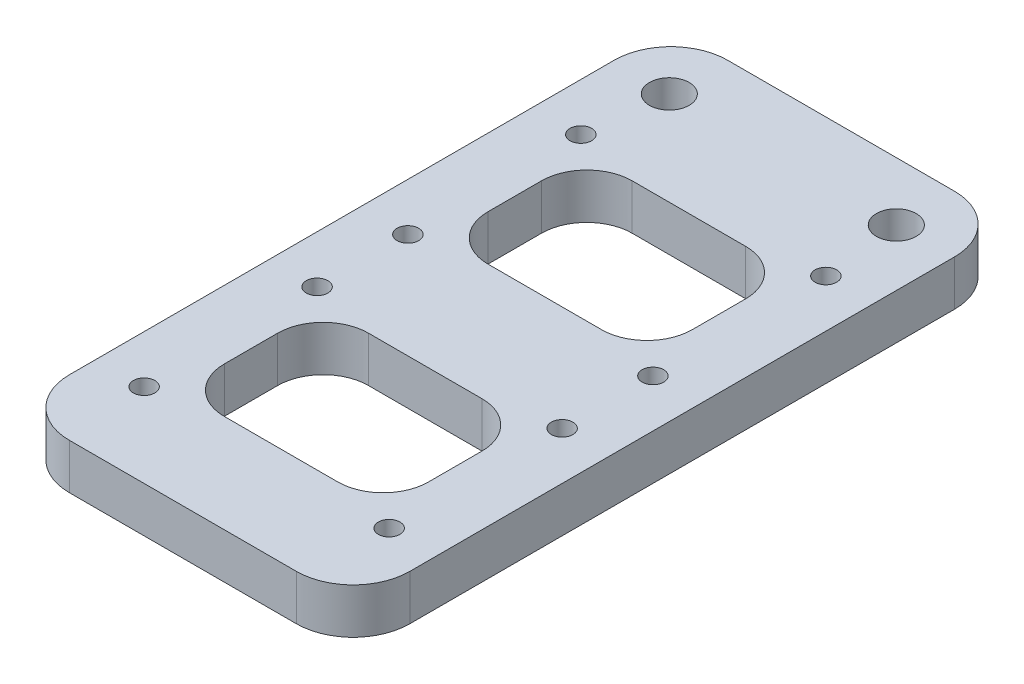
ISO-10303-21;
HEADER;
FILE_DESCRIPTION(('STEP AP214'),'2;1');
FILE_NAME('part.step','',(''),(''),'','','');
FILE_SCHEMA(('AUTOMOTIVE_DESIGN { 1 0 10303 214 1 1 1 1 }'));
ENDSEC;
DATA;
#1=APPLICATION_CONTEXT('core data for automotive mechanical design processes');
#2=APPLICATION_PROTOCOL_DEFINITION('international standard','automotive_design',2000,#1);
#3=PRODUCT_CONTEXT('',#1,'mechanical');
#4=PRODUCT('Part','Part','',(#3));
#5=PRODUCT_RELATED_PRODUCT_CATEGORY('part','',(#4));
#6=PRODUCT_DEFINITION_FORMATION('','',#4);
#7=PRODUCT_DEFINITION_CONTEXT('part definition',#1,'design');
#8=PRODUCT_DEFINITION('design','',#6,#7);
#9=PRODUCT_DEFINITION_SHAPE('','',#8);
#10=(LENGTH_UNIT() NAMED_UNIT(*) SI_UNIT(.MILLI.,.METRE.));
#11=(NAMED_UNIT(*) PLANE_ANGLE_UNIT() SI_UNIT($,.RADIAN.));
#12=(NAMED_UNIT(*) SI_UNIT($,.STERADIAN.) SOLID_ANGLE_UNIT());
#13=UNCERTAINTY_MEASURE_WITH_UNIT(LENGTH_MEASURE(1.E-05),#10,'distance_accuracy_value','');
#14=(GEOMETRIC_REPRESENTATION_CONTEXT(3) GLOBAL_UNCERTAINTY_ASSIGNED_CONTEXT((#13)) GLOBAL_UNIT_ASSIGNED_CONTEXT((#10,
#11,#12)) REPRESENTATION_CONTEXT('',''));
#15=CARTESIAN_POINT('',(0.,0.,0.));
#16=DIRECTION('',(0.,0.,1.));
#17=DIRECTION('',(1.,0.,0.));
#18=AXIS2_PLACEMENT_3D('',#15,#16,#17);
#19=CARTESIAN_POINT('',(15.,4.,15.));
#20=DIRECTION('',(-1.,0.,0.));
#21=DIRECTION('',(0.,0.,1.));
#22=AXIS2_PLACEMENT_3D('',#19,#20,#21);
#23=PLANE('',#22);
#24=DIRECTION('',(0.,0.,-1.));
#25=VECTOR('',#24,1.);
#26=CARTESIAN_POINT('',(15.,4.,15.));
#27=LINE('',#26,#25);
#28=CARTESIAN_POINT('',(15.,4.,10.));
#29=VERTEX_POINT('',#28);
#30=CARTESIAN_POINT('',(15.,4.,-38.));
#31=VERTEX_POINT('',#30);
#32=EDGE_CURVE('E464',#29,#31,#27,.T.);
#33=ORIENTED_EDGE('',*,*,#32,.F.);
#34=DIRECTION('',(0.,-1.,0.));
#35=VECTOR('',#34,1.);
#36=CARTESIAN_POINT('',(15.,4.,10.));
#37=LINE('',#36,#35);
#38=CARTESIAN_POINT('',(15.,0.,10.));
#39=VERTEX_POINT('',#38);
#40=EDGE_CURVE('E489',#29,#39,#37,.T.);
#41=ORIENTED_EDGE('',*,*,#40,.T.);
#42=DIRECTION('',(0.,0.,-1.));
#43=VECTOR('',#42,1.);
#44=CARTESIAN_POINT('',(15.,0.,15.));
#45=LINE('',#44,#43);
#46=CARTESIAN_POINT('',(15.,0.,-38.));
#47=VERTEX_POINT('',#46);
#48=EDGE_CURVE('E463',#39,#47,#45,.T.);
#49=ORIENTED_EDGE('',*,*,#48,.T.);
#50=DIRECTION('',(0.,1.,0.));
#51=VECTOR('',#50,1.);
#52=CARTESIAN_POINT('',(15.,4.,-38.));
#53=LINE('',#52,#51);
#54=EDGE_CURVE('E476',#47,#31,#53,.T.);
#55=ORIENTED_EDGE('',*,*,#54,.T.);
#56=EDGE_LOOP('',(#33,#41,#49,#55));
#57=FACE_BOUND('',#56,.T.);
#58=ADVANCED_FACE('F39',(#57),#23,.F.);
#59=CARTESIAN_POINT('',(-15.,4.,15.));
#60=DIRECTION('',(1.,0.,0.));
#61=DIRECTION('',(0.,0.,-1.));
#62=AXIS2_PLACEMENT_3D('',#59,#60,#61);
#63=PLANE('',#62);
#64=DIRECTION('',(0.,0.,1.));
#65=VECTOR('',#64,1.);
#66=CARTESIAN_POINT('',(-15.,0.,15.));
#67=LINE('',#66,#65);
#68=CARTESIAN_POINT('',(-15.,0.,-38.));
#69=VERTEX_POINT('',#68);
#70=CARTESIAN_POINT('',(-15.,0.,10.));
#71=VERTEX_POINT('',#70);
#72=EDGE_CURVE('E480',#69,#71,#67,.T.);
#73=ORIENTED_EDGE('',*,*,#72,.T.);
#74=DIRECTION('',(0.,-1.,0.));
#75=VECTOR('',#74,1.);
#76=CARTESIAN_POINT('',(-15.,4.,10.));
#77=LINE('',#76,#75);
#78=CARTESIAN_POINT('',(-15.,4.,10.));
#79=VERTEX_POINT('',#78);
#80=EDGE_CURVE('E55',#71,#79,#77,.F.);
#81=ORIENTED_EDGE('',*,*,#80,.T.);
#82=DIRECTION('',(0.,0.,1.));
#83=VECTOR('',#82,1.);
#84=CARTESIAN_POINT('',(-15.,4.,15.));
#85=LINE('',#84,#83);
#86=CARTESIAN_POINT('',(-15.,4.,-38.));
#87=VERTEX_POINT('',#86);
#88=EDGE_CURVE('E468',#87,#79,#85,.T.);
#89=ORIENTED_EDGE('',*,*,#88,.F.);
#90=DIRECTION('',(0.,1.,0.));
#91=VECTOR('',#90,1.);
#92=CARTESIAN_POINT('',(-15.,0.,-38.));
#93=LINE('',#92,#91);
#94=EDGE_CURVE('E523',#87,#69,#93,.F.);
#95=ORIENTED_EDGE('',*,*,#94,.T.);
#96=EDGE_LOOP('',(#73,#81,#89,#95));
#97=FACE_BOUND('',#96,.T.);
#98=ADVANCED_FACE('F550',(#97),#63,.F.);
#99=CARTESIAN_POINT('',(-15.,4.,15.));
#100=DIRECTION('',(0.,0.,-1.));
#101=DIRECTION('',(-1.,0.,0.));
#102=AXIS2_PLACEMENT_3D('',#99,#100,#101);
#103=PLANE('',#102);
#104=DIRECTION('',(1.,0.,0.));
#105=VECTOR('',#104,1.);
#106=CARTESIAN_POINT('',(-15.,0.,15.));
#107=LINE('',#106,#105);
#108=CARTESIAN_POINT('',(-10.,0.,15.));
#109=VERTEX_POINT('',#108);
#110=CARTESIAN_POINT('',(10.,0.,15.));
#111=VERTEX_POINT('',#110);
#112=EDGE_CURVE('E469',#109,#111,#107,.T.);
#113=ORIENTED_EDGE('',*,*,#112,.T.);
#114=DIRECTION('',(0.,-1.,0.));
#115=VECTOR('',#114,1.);
#116=CARTESIAN_POINT('',(10.,4.,15.));
#117=LINE('',#116,#115);
#118=CARTESIAN_POINT('',(10.,4.,15.));
#119=VERTEX_POINT('',#118);
#120=EDGE_CURVE('E509',#111,#119,#117,.F.);
#121=ORIENTED_EDGE('',*,*,#120,.T.);
#122=DIRECTION('',(1.,0.,0.));
#123=VECTOR('',#122,1.);
#124=CARTESIAN_POINT('',(-15.,4.,15.));
#125=LINE('',#124,#123);
#126=CARTESIAN_POINT('',(-10.,4.,15.));
#127=VERTEX_POINT('',#126);
#128=EDGE_CURVE('E472',#127,#119,#125,.T.);
#129=ORIENTED_EDGE('',*,*,#128,.F.);
#130=DIRECTION('',(0.,-1.,0.));
#131=VECTOR('',#130,1.);
#132=CARTESIAN_POINT('',(-10.,4.,15.));
#133=LINE('',#132,#131);
#134=EDGE_CURVE('E505',#127,#109,#133,.T.);
#135=ORIENTED_EDGE('',*,*,#134,.T.);
#136=EDGE_LOOP('',(#113,#121,#129,#135));
#137=FACE_BOUND('',#136,.T.);
#138=ADVANCED_FACE('F557',(#137),#103,.F.);
#139=CARTESIAN_POINT('',(0.,4.,0.));
#140=DIRECTION('',(0.,-1.,0.));
#141=DIRECTION('',(0.,0.,-1.));
#142=AXIS2_PLACEMENT_3D('',#139,#140,#141);
#143=PLANE('',#142);
#144=CARTESIAN_POINT('',(10.795,4.,7.62));
#145=DIRECTION('',(0.,1.,0.));
#146=DIRECTION('',(0.,0.,1.));
#147=AXIS2_PLACEMENT_3D('',#144,#145,#146);
#148=CIRCLE('',#147,0.949999999999999);
#149=CARTESIAN_POINT('',(10.795,4.,8.57));
#150=VERTEX_POINT('',#149);
#151=EDGE_CURVE('E308',#150,#150,#148,.T.);
#152=ORIENTED_EDGE('',*,*,#151,.F.);
#153=EDGE_LOOP('',(#152));
#154=FACE_BOUND('',#153,.T.);
#155=CARTESIAN_POINT('',(10.795,4.,-7.62));
#156=DIRECTION('',(0.,1.,0.));
#157=DIRECTION('',(0.,0.,1.));
#158=AXIS2_PLACEMENT_3D('',#155,#156,#157);
#159=CIRCLE('',#158,0.949999999999999);
#160=CARTESIAN_POINT('',(10.795,4.,-6.67));
#161=VERTEX_POINT('',#160);
#162=EDGE_CURVE('E316',#161,#161,#159,.T.);
#163=ORIENTED_EDGE('',*,*,#162,.F.);
#164=EDGE_LOOP('',(#163));
#165=FACE_BOUND('',#164,.T.);
#166=CARTESIAN_POINT('',(-10.795,4.,-7.62));
#167=DIRECTION('',(0.,1.,0.));
#168=DIRECTION('',(0.,0.,1.));
#169=AXIS2_PLACEMENT_3D('',#166,#167,#168);
#170=CIRCLE('',#169,0.949999999999999);
#171=CARTESIAN_POINT('',(-10.795,4.,-6.67));
#172=VERTEX_POINT('',#171);
#173=EDGE_CURVE('E324',#172,#172,#170,.T.);
#174=ORIENTED_EDGE('',*,*,#173,.F.);
#175=EDGE_LOOP('',(#174));
#176=FACE_BOUND('',#175,.T.);
#177=DIRECTION('',(1.,0.,0.));
#178=VECTOR('',#177,1.);
#179=CARTESIAN_POINT('',(-5.,4.,6.35294117647059));
#180=LINE('',#179,#178);
#181=CARTESIAN_POINT('',(-5.,4.,6.35294117647059));
#182=VERTEX_POINT('',#181);
#183=CARTESIAN_POINT('',(5.,4.,6.35294117647059));
#184=VERTEX_POINT('',#183);
#185=EDGE_CURVE('E366',#182,#184,#180,.T.);
#186=ORIENTED_EDGE('',*,*,#185,.F.);
#187=CARTESIAN_POINT('',(-5.,4.,2.35294117647059));
#188=DIRECTION('',(0.,1.,0.));
#189=DIRECTION('',(0.,0.,-1.));
#190=AXIS2_PLACEMENT_3D('',#187,#188,#189);
#191=CIRCLE('',#190,4.);
#192=CARTESIAN_POINT('',(-9.,4.,2.35294117647059));
#193=VERTEX_POINT('',#192);
#194=EDGE_CURVE('E363',#193,#182,#191,.T.);
#195=ORIENTED_EDGE('',*,*,#194,.F.);
#196=DIRECTION('',(0.,0.,1.));
#197=VECTOR('',#196,1.);
#198=CARTESIAN_POINT('',(-9.,4.,2.35294117647059));
#199=LINE('',#198,#197);
#200=CARTESIAN_POINT('',(-9.,4.,-2.35294117647059));
#201=VERTEX_POINT('',#200);
#202=EDGE_CURVE('E334',#201,#193,#199,.T.);
#203=ORIENTED_EDGE('',*,*,#202,.F.);
#204=CARTESIAN_POINT('',(-5.,4.,-2.35294117647059));
#205=DIRECTION('',(0.,1.,0.));
#206=DIRECTION('',(0.,0.,-1.));
#207=AXIS2_PLACEMENT_3D('',#204,#205,#206);
#208=CIRCLE('',#207,4.);
#209=CARTESIAN_POINT('',(-5.,4.,-6.35294117647059));
#210=VERTEX_POINT('',#209);
#211=EDGE_CURVE('E387',#210,#201,#208,.T.);
#212=ORIENTED_EDGE('',*,*,#211,.F.);
#213=DIRECTION('',(-1.,0.,0.));
#214=VECTOR('',#213,1.);
#215=CARTESIAN_POINT('',(-5.,4.,-6.35294117647059));
#216=LINE('',#215,#214);
#217=CARTESIAN_POINT('',(5.,4.,-6.35294117647058));
#218=VERTEX_POINT('',#217);
#219=EDGE_CURVE('E383',#218,#210,#216,.T.);
#220=ORIENTED_EDGE('',*,*,#219,.F.);
#221=CARTESIAN_POINT('',(5.,4.,-2.35294117647059));
#222=DIRECTION('',(0.,1.,0.));
#223=DIRECTION('',(0.,0.,-1.));
#224=AXIS2_PLACEMENT_3D('',#221,#222,#223);
#225=CIRCLE('',#224,4.);
#226=CARTESIAN_POINT('',(9.,4.,-2.35294117647059));
#227=VERTEX_POINT('',#226);
#228=EDGE_CURVE('E379',#227,#218,#225,.T.);
#229=ORIENTED_EDGE('',*,*,#228,.F.);
#230=DIRECTION('',(0.,0.,-1.));
#231=VECTOR('',#230,1.);
#232=CARTESIAN_POINT('',(9.,4.,2.35294117647059));
#233=LINE('',#232,#231);
#234=CARTESIAN_POINT('',(9.,4.,2.35294117647059));
#235=VERTEX_POINT('',#234);
#236=EDGE_CURVE('E375',#235,#227,#233,.T.);
#237=ORIENTED_EDGE('',*,*,#236,.F.);
#238=CARTESIAN_POINT('',(5.,4.,2.35294117647059));
#239=DIRECTION('',(0.,1.,0.));
#240=DIRECTION('',(0.,0.,1.));
#241=AXIS2_PLACEMENT_3D('',#238,#239,#240);
#242=CIRCLE('',#241,4.);
#243=EDGE_CURVE('E371',#184,#235,#242,.T.);
#244=ORIENTED_EDGE('',*,*,#243,.F.);
#245=EDGE_LOOP('',(#186,#195,#203,#212,#220,#229,#237,#244));
#246=FACE_BOUND('',#245,.T.);
#247=CARTESIAN_POINT('',(-10.795,4.,-30.86));
#248=DIRECTION('',(0.,1.,0.));
#249=DIRECTION('',(0.,0.,1.));
#250=AXIS2_PLACEMENT_3D('',#247,#248,#249);
#251=CIRCLE('',#250,0.949999999999999);
#252=CARTESIAN_POINT('',(-10.795,4.,-29.91));
#253=VERTEX_POINT('',#252);
#254=EDGE_CURVE('E420',#253,#253,#251,.T.);
#255=ORIENTED_EDGE('',*,*,#254,.F.);
#256=EDGE_LOOP('',(#255));
#257=FACE_BOUND('',#256,.T.);
#258=CARTESIAN_POINT('',(10.795,4.,-30.86));
#259=DIRECTION('',(0.,1.,0.));
#260=DIRECTION('',(0.,0.,1.));
#261=AXIS2_PLACEMENT_3D('',#258,#259,#260);
#262=CIRCLE('',#261,0.949999999999999);
#263=CARTESIAN_POINT('',(10.795,4.,-29.91));
#264=VERTEX_POINT('',#263);
#265=EDGE_CURVE('E428',#264,#264,#262,.T.);
#266=ORIENTED_EDGE('',*,*,#265,.F.);
#267=EDGE_LOOP('',(#266));
#268=FACE_BOUND('',#267,.T.);
#269=CARTESIAN_POINT('',(10.795,4.,-15.62));
#270=DIRECTION('',(0.,1.,0.));
#271=DIRECTION('',(0.,0.,1.));
#272=AXIS2_PLACEMENT_3D('',#269,#270,#271);
#273=CIRCLE('',#272,0.95);
#274=CARTESIAN_POINT('',(10.795,4.,-14.67));
#275=VERTEX_POINT('',#274);
#276=EDGE_CURVE('E436',#275,#275,#273,.T.);
#277=ORIENTED_EDGE('',*,*,#276,.F.);
#278=EDGE_LOOP('',(#277));
#279=FACE_BOUND('',#278,.T.);
#280=CARTESIAN_POINT('',(-10.795,4.,-15.62));
#281=DIRECTION('',(0.,1.,0.));
#282=DIRECTION('',(0.,0.,1.));
#283=AXIS2_PLACEMENT_3D('',#280,#281,#282);
#284=CIRCLE('',#283,0.95);
#285=CARTESIAN_POINT('',(-10.795,4.,-14.67));
#286=VERTEX_POINT('',#285);
#287=EDGE_CURVE('E444',#286,#286,#284,.T.);
#288=ORIENTED_EDGE('',*,*,#287,.F.);
#289=EDGE_LOOP('',(#288));
#290=FACE_BOUND('',#289,.T.);
#291=CARTESIAN_POINT('',(10.,4.,-37.86));
#292=DIRECTION('',(0.,1.,0.));
#293=DIRECTION('',(0.,0.,1.));
#294=AXIS2_PLACEMENT_3D('',#291,#292,#293);
#295=CIRCLE('',#294,1.75);
#296=CARTESIAN_POINT('',(10.,4.,-36.11));
#297=VERTEX_POINT('',#296);
#298=EDGE_CURVE('E691',#297,#297,#295,.T.);
#299=ORIENTED_EDGE('',*,*,#298,.F.);
#300=EDGE_LOOP('',(#299));
#301=FACE_BOUND('',#300,.T.);
#302=CARTESIAN_POINT('',(-10.,4.,-37.86));
#303=DIRECTION('',(0.,1.,0.));
#304=DIRECTION('',(0.,0.,1.));
#305=AXIS2_PLACEMENT_3D('',#302,#303,#304);
#306=CIRCLE('',#305,1.75);
#307=CARTESIAN_POINT('',(-10.,4.,-36.11));
#308=VERTEX_POINT('',#307);
#309=EDGE_CURVE('E237',#308,#308,#306,.T.);
#310=ORIENTED_EDGE('',*,*,#309,.F.);
#311=EDGE_LOOP('',(#310));
#312=FACE_BOUND('',#311,.T.);
#313=DIRECTION('',(1.,0.,0.));
#314=VECTOR('',#313,1.);
#315=CARTESIAN_POINT('',(-5.,4.,-16.8870588235294));
#316=LINE('',#315,#314);
#317=CARTESIAN_POINT('',(-5.,4.,-16.8870588235294));
#318=VERTEX_POINT('',#317);
#319=CARTESIAN_POINT('',(5.,4.,-16.8870588235294));
#320=VERTEX_POINT('',#319);
#321=EDGE_CURVE('E261',#318,#320,#316,.T.);
#322=ORIENTED_EDGE('',*,*,#321,.F.);
#323=CARTESIAN_POINT('',(-5.,4.,-20.8870588235294));
#324=DIRECTION('',(0.,1.,0.));
#325=DIRECTION('',(0.,0.,-1.));
#326=AXIS2_PLACEMENT_3D('',#323,#324,#325);
#327=CIRCLE('',#326,4.);
#328=CARTESIAN_POINT('',(-9.,4.,-20.8870588235294));
#329=VERTEX_POINT('',#328);
#330=EDGE_CURVE('E208',#329,#318,#327,.T.);
#331=ORIENTED_EDGE('',*,*,#330,.F.);
#332=DIRECTION('',(0.,0.,1.));
#333=VECTOR('',#332,1.);
#334=CARTESIAN_POINT('',(-9.,4.,-20.8870588235294));
#335=LINE('',#334,#333);
#336=CARTESIAN_POINT('',(-9.,4.,-25.5929411764706));
#337=VERTEX_POINT('',#336);
#338=EDGE_CURVE('E230',#337,#329,#335,.T.);
#339=ORIENTED_EDGE('',*,*,#338,.F.);
#340=CARTESIAN_POINT('',(-5.,4.,-25.5929411764706));
#341=DIRECTION('',(0.,1.,0.));
#342=DIRECTION('',(0.,0.,-1.));
#343=AXIS2_PLACEMENT_3D('',#340,#341,#342);
#344=CIRCLE('',#343,4.);
#345=CARTESIAN_POINT('',(-5.,4.,-29.5929411764706));
#346=VERTEX_POINT('',#345);
#347=EDGE_CURVE('E234',#346,#337,#344,.T.);
#348=ORIENTED_EDGE('',*,*,#347,.F.);
#349=DIRECTION('',(-1.,0.,0.));
#350=VECTOR('',#349,1.);
#351=CARTESIAN_POINT('',(-5.,4.,-29.5929411764706));
#352=LINE('',#351,#350);
#353=CARTESIAN_POINT('',(5.,4.,-29.5929411764706));
#354=VERTEX_POINT('',#353);
#355=EDGE_CURVE('E276',#354,#346,#352,.T.);
#356=ORIENTED_EDGE('',*,*,#355,.F.);
#357=CARTESIAN_POINT('',(5.,4.,-25.5929411764706));
#358=DIRECTION('',(0.,1.,0.));
#359=DIRECTION('',(0.,0.,-1.));
#360=AXIS2_PLACEMENT_3D('',#357,#358,#359);
#361=CIRCLE('',#360,4.);
#362=CARTESIAN_POINT('',(9.00000000000001,4.,-25.5929411764706));
#363=VERTEX_POINT('',#362);
#364=EDGE_CURVE('E272',#363,#354,#361,.T.);
#365=ORIENTED_EDGE('',*,*,#364,.F.);
#366=DIRECTION('',(0.,0.,-1.));
#367=VECTOR('',#366,1.);
#368=CARTESIAN_POINT('',(9.00000000000001,4.,-20.8870588235294));
#369=LINE('',#368,#367);
#370=CARTESIAN_POINT('',(9.00000000000001,4.,-20.8870588235294));
#371=VERTEX_POINT('',#370);
#372=EDGE_CURVE('E268',#371,#363,#369,.T.);
#373=ORIENTED_EDGE('',*,*,#372,.F.);
#374=CARTESIAN_POINT('',(5.,4.,-20.8870588235294));
#375=DIRECTION('',(0.,1.,0.));
#376=DIRECTION('',(0.,0.,1.));
#377=AXIS2_PLACEMENT_3D('',#374,#375,#376);
#378=CIRCLE('',#377,4.);
#379=EDGE_CURVE('E264',#320,#371,#378,.T.);
#380=ORIENTED_EDGE('',*,*,#379,.F.);
#381=EDGE_LOOP('',(#322,#331,#339,#348,#356,#365,#373,#380));
#382=FACE_BOUND('',#381,.T.);
#383=CARTESIAN_POINT('',(-10.795,4.,7.62));
#384=DIRECTION('',(0.,1.,0.));
#385=DIRECTION('',(0.,0.,1.));
#386=AXIS2_PLACEMENT_3D('',#383,#384,#385);
#387=CIRCLE('',#386,0.949999999999999);
#388=CARTESIAN_POINT('',(-10.795,4.,8.57));
#389=VERTEX_POINT('',#388);
#390=EDGE_CURVE('E307',#389,#389,#387,.T.);
#391=ORIENTED_EDGE('',*,*,#390,.F.);
#392=EDGE_LOOP('',(#391));
#393=FACE_BOUND('',#392,.T.);
#394=ORIENTED_EDGE('',*,*,#128,.T.);
#395=CARTESIAN_POINT('',(10.,4.,10.));
#396=DIRECTION('',(0.,-1.,0.));
#397=DIRECTION('',(0.,0.,-1.));
#398=AXIS2_PLACEMENT_3D('',#395,#396,#397);
#399=CIRCLE('',#398,5.);
#400=EDGE_CURVE('E520',#119,#29,#399,.F.);
#401=ORIENTED_EDGE('',*,*,#400,.T.);
#402=ORIENTED_EDGE('',*,*,#32,.T.);
#403=CARTESIAN_POINT('',(10.,4.,-38.));
#404=DIRECTION('',(0.,-1.,0.));
#405=DIRECTION('',(0.,0.,-1.));
#406=AXIS2_PLACEMENT_3D('',#403,#404,#405);
#407=CIRCLE('',#406,5.);
#408=CARTESIAN_POINT('',(10.,4.,-43.));
#409=VERTEX_POINT('',#408);
#410=EDGE_CURVE('E514',#31,#409,#407,.F.);
#411=ORIENTED_EDGE('',*,*,#410,.T.);
#412=DIRECTION('',(-1.,0.,0.));
#413=VECTOR('',#412,1.);
#414=CARTESIAN_POINT('',(-15.,4.,-43.));
#415=LINE('',#414,#413);
#416=CARTESIAN_POINT('',(-10.,4.,-43.));
#417=VERTEX_POINT('',#416);
#418=EDGE_CURVE('E453',#409,#417,#415,.T.);
#419=ORIENTED_EDGE('',*,*,#418,.T.);
#420=CARTESIAN_POINT('',(-10.,4.,-38.));
#421=DIRECTION('',(0.,-1.,0.));
#422=DIRECTION('',(0.,0.,-1.));
#423=AXIS2_PLACEMENT_3D('',#420,#421,#422);
#424=CIRCLE('',#423,5.);
#425=EDGE_CURVE('E62',#417,#87,#424,.F.);
#426=ORIENTED_EDGE('',*,*,#425,.T.);
#427=ORIENTED_EDGE('',*,*,#88,.T.);
#428=CARTESIAN_POINT('',(-10.,4.,10.));
#429=DIRECTION('',(0.,-1.,0.));
#430=DIRECTION('',(0.,0.,-1.));
#431=AXIS2_PLACEMENT_3D('',#428,#429,#430);
#432=CIRCLE('',#431,5.);
#433=EDGE_CURVE('E517',#79,#127,#432,.F.);
#434=ORIENTED_EDGE('',*,*,#433,.T.);
#435=EDGE_LOOP('',(#394,#401,#402,#411,#419,#426,#427,#434));
#436=FACE_BOUND('',#435,.T.);
#437=ADVANCED_FACE('F537',(#154,#165,#176,#246,#257,#268,#279,#290,#301,#312,#382,#393,#436),
#143,.F.);
#438=CARTESIAN_POINT('',(0.,0.,0.));
#439=DIRECTION('',(0.,-1.,0.));
#440=DIRECTION('',(0.,0.,-1.));
#441=AXIS2_PLACEMENT_3D('',#438,#439,#440);
#442=PLANE('',#441);
#443=CARTESIAN_POINT('',(10.795,0.,7.62));
#444=DIRECTION('',(0.,1.,0.));
#445=DIRECTION('',(0.,0.,1.));
#446=AXIS2_PLACEMENT_3D('',#443,#444,#445);
#447=CIRCLE('',#446,0.949999999999999);
#448=CARTESIAN_POINT('',(10.795,0.,8.57));
#449=VERTEX_POINT('',#448);
#450=EDGE_CURVE('E303',#449,#449,#447,.T.);
#451=ORIENTED_EDGE('',*,*,#450,.T.);
#452=EDGE_LOOP('',(#451));
#453=FACE_BOUND('',#452,.T.);
#454=CARTESIAN_POINT('',(10.795,0.,-7.62));
#455=DIRECTION('',(0.,1.,0.));
#456=DIRECTION('',(0.,0.,1.));
#457=AXIS2_PLACEMENT_3D('',#454,#455,#456);
#458=CIRCLE('',#457,0.949999999999999);
#459=CARTESIAN_POINT('',(10.795,0.,-6.67));
#460=VERTEX_POINT('',#459);
#461=EDGE_CURVE('E312',#460,#460,#458,.T.);
#462=ORIENTED_EDGE('',*,*,#461,.T.);
#463=EDGE_LOOP('',(#462));
#464=FACE_BOUND('',#463,.T.);
#465=CARTESIAN_POINT('',(-10.795,0.,-7.62));
#466=DIRECTION('',(0.,1.,0.));
#467=DIRECTION('',(0.,0.,1.));
#468=AXIS2_PLACEMENT_3D('',#465,#466,#467);
#469=CIRCLE('',#468,0.949999999999999);
#470=CARTESIAN_POINT('',(-10.795,0.,-6.67));
#471=VERTEX_POINT('',#470);
#472=EDGE_CURVE('E320',#471,#471,#469,.T.);
#473=ORIENTED_EDGE('',*,*,#472,.T.);
#474=EDGE_LOOP('',(#473));
#475=FACE_BOUND('',#474,.T.);
#476=CARTESIAN_POINT('',(-5.,0.,2.35294117647059));
#477=DIRECTION('',(0.,1.,0.));
#478=DIRECTION('',(0.,0.,-1.));
#479=AXIS2_PLACEMENT_3D('',#476,#477,#478);
#480=CIRCLE('',#479,4.);
#481=CARTESIAN_POINT('',(-9.,0.,2.35294117647059));
#482=VERTEX_POINT('',#481);
#483=CARTESIAN_POINT('',(-5.,0.,6.35294117647059));
#484=VERTEX_POINT('',#483);
#485=EDGE_CURVE('E329',#482,#484,#480,.T.);
#486=ORIENTED_EDGE('',*,*,#485,.T.);
#487=DIRECTION('',(1.,0.,0.));
#488=VECTOR('',#487,1.);
#489=CARTESIAN_POINT('',(-5.,0.,6.35294117647059));
#490=LINE('',#489,#488);
#491=CARTESIAN_POINT('',(5.,0.,6.35294117647059));
#492=VERTEX_POINT('',#491);
#493=EDGE_CURVE('E333',#484,#492,#490,.T.);
#494=ORIENTED_EDGE('',*,*,#493,.T.);
#495=CARTESIAN_POINT('',(5.,0.,2.35294117647059));
#496=DIRECTION('',(0.,1.,0.));
#497=DIRECTION('',(0.,0.,1.));
#498=AXIS2_PLACEMENT_3D('',#495,#496,#497);
#499=CIRCLE('',#498,4.);
#500=CARTESIAN_POINT('',(9.,0.,2.35294117647059));
#501=VERTEX_POINT('',#500);
#502=EDGE_CURVE('E338',#492,#501,#499,.T.);
#503=ORIENTED_EDGE('',*,*,#502,.T.);
#504=DIRECTION('',(0.,0.,-1.));
#505=VECTOR('',#504,1.);
#506=CARTESIAN_POINT('',(9.,0.,2.35294117647059));
#507=LINE('',#506,#505);
#508=CARTESIAN_POINT('',(9.,0.,-2.35294117647059));
#509=VERTEX_POINT('',#508);
#510=EDGE_CURVE('E342',#501,#509,#507,.T.);
#511=ORIENTED_EDGE('',*,*,#510,.T.);
#512=CARTESIAN_POINT('',(5.,0.,-2.35294117647059));
#513=DIRECTION('',(0.,1.,0.));
#514=DIRECTION('',(0.,0.,-1.));
#515=AXIS2_PLACEMENT_3D('',#512,#513,#514);
#516=CIRCLE('',#515,4.);
#517=CARTESIAN_POINT('',(5.,0.,-6.35294117647058));
#518=VERTEX_POINT('',#517);
#519=EDGE_CURVE('E346',#509,#518,#516,.T.);
#520=ORIENTED_EDGE('',*,*,#519,.T.);
#521=DIRECTION('',(-1.,0.,0.));
#522=VECTOR('',#521,1.);
#523=CARTESIAN_POINT('',(-5.,0.,-6.35294117647059));
#524=LINE('',#523,#522);
#525=CARTESIAN_POINT('',(-5.,0.,-6.35294117647059));
#526=VERTEX_POINT('',#525);
#527=EDGE_CURVE('E350',#518,#526,#524,.T.);
#528=ORIENTED_EDGE('',*,*,#527,.T.);
#529=CARTESIAN_POINT('',(-5.,0.,-2.35294117647059));
#530=DIRECTION('',(0.,1.,0.));
#531=DIRECTION('',(0.,0.,-1.));
#532=AXIS2_PLACEMENT_3D('',#529,#530,#531);
#533=CIRCLE('',#532,4.);
#534=CARTESIAN_POINT('',(-9.,0.,-2.35294117647059));
#535=VERTEX_POINT('',#534);
#536=EDGE_CURVE('E354',#526,#535,#533,.T.);
#537=ORIENTED_EDGE('',*,*,#536,.T.);
#538=DIRECTION('',(0.,0.,1.));
#539=VECTOR('',#538,1.);
#540=CARTESIAN_POINT('',(-9.,0.,2.35294117647059));
#541=LINE('',#540,#539);
#542=EDGE_CURVE('E358',#535,#482,#541,.T.);
#543=ORIENTED_EDGE('',*,*,#542,.T.);
#544=EDGE_LOOP('',(#486,#494,#503,#511,#520,#528,#537,#543));
#545=FACE_BOUND('',#544,.T.);
#546=CARTESIAN_POINT('',(-10.795,0.,-30.86));
#547=DIRECTION('',(0.,1.,0.));
#548=DIRECTION('',(0.,0.,1.));
#549=AXIS2_PLACEMENT_3D('',#546,#547,#548);
#550=CIRCLE('',#549,0.949999999999999);
#551=CARTESIAN_POINT('',(-10.795,0.,-29.91));
#552=VERTEX_POINT('',#551);
#553=EDGE_CURVE('E367',#552,#552,#550,.T.);
#554=ORIENTED_EDGE('',*,*,#553,.T.);
#555=EDGE_LOOP('',(#554));
#556=FACE_BOUND('',#555,.T.);
#557=CARTESIAN_POINT('',(10.795,0.,-30.86));
#558=DIRECTION('',(0.,1.,0.));
#559=DIRECTION('',(0.,0.,1.));
#560=AXIS2_PLACEMENT_3D('',#557,#558,#559);
#561=CIRCLE('',#560,0.949999999999999);
#562=CARTESIAN_POINT('',(10.795,0.,-29.91));
#563=VERTEX_POINT('',#562);
#564=EDGE_CURVE('E424',#563,#563,#561,.T.);
#565=ORIENTED_EDGE('',*,*,#564,.T.);
#566=EDGE_LOOP('',(#565));
#567=FACE_BOUND('',#566,.T.);
#568=CARTESIAN_POINT('',(10.795,0.,-15.62));
#569=DIRECTION('',(0.,1.,0.));
#570=DIRECTION('',(0.,0.,1.));
#571=AXIS2_PLACEMENT_3D('',#568,#569,#570);
#572=CIRCLE('',#571,0.95);
#573=CARTESIAN_POINT('',(10.795,0.,-14.67));
#574=VERTEX_POINT('',#573);
#575=EDGE_CURVE('E432',#574,#574,#572,.T.);
#576=ORIENTED_EDGE('',*,*,#575,.T.);
#577=EDGE_LOOP('',(#576));
#578=FACE_BOUND('',#577,.T.);
#579=CARTESIAN_POINT('',(-10.795,0.,-15.62));
#580=DIRECTION('',(0.,1.,0.));
#581=DIRECTION('',(0.,0.,1.));
#582=AXIS2_PLACEMENT_3D('',#579,#580,#581);
#583=CIRCLE('',#582,0.95);
#584=CARTESIAN_POINT('',(-10.795,0.,-14.67));
#585=VERTEX_POINT('',#584);
#586=EDGE_CURVE('E440',#585,#585,#583,.T.);
#587=ORIENTED_EDGE('',*,*,#586,.T.);
#588=EDGE_LOOP('',(#587));
#589=FACE_BOUND('',#588,.T.);
#590=CARTESIAN_POINT('',(10.,0.,-37.86));
#591=DIRECTION('',(0.,1.,0.));
#592=DIRECTION('',(0.,0.,1.));
#593=AXIS2_PLACEMENT_3D('',#590,#591,#592);
#594=CIRCLE('',#593,1.75);
#595=CARTESIAN_POINT('',(10.,0.,-36.11));
#596=VERTEX_POINT('',#595);
#597=EDGE_CURVE('E448',#596,#596,#594,.T.);
#598=ORIENTED_EDGE('',*,*,#597,.T.);
#599=EDGE_LOOP('',(#598));
#600=FACE_BOUND('',#599,.T.);
#601=CARTESIAN_POINT('',(-10.,0.,-37.86));
#602=DIRECTION('',(0.,1.,0.));
#603=DIRECTION('',(0.,0.,1.));
#604=AXIS2_PLACEMENT_3D('',#601,#602,#603);
#605=CIRCLE('',#604,1.75);
#606=CARTESIAN_POINT('',(-10.,0.,-36.11));
#607=VERTEX_POINT('',#606);
#608=EDGE_CURVE('E694',#607,#607,#605,.T.);
#609=ORIENTED_EDGE('',*,*,#608,.T.);
#610=EDGE_LOOP('',(#609));
#611=FACE_BOUND('',#610,.T.);
#612=CARTESIAN_POINT('',(-5.,0.,-20.8870588235294));
#613=DIRECTION('',(0.,1.,0.));
#614=DIRECTION('',(0.,0.,-1.));
#615=AXIS2_PLACEMENT_3D('',#612,#613,#614);
#616=CIRCLE('',#615,4.);
#617=CARTESIAN_POINT('',(-9.,0.,-20.8870588235294));
#618=VERTEX_POINT('',#617);
#619=CARTESIAN_POINT('',(-5.,0.,-16.8870588235294));
#620=VERTEX_POINT('',#619);
#621=EDGE_CURVE('E205',#618,#620,#616,.T.);
#622=ORIENTED_EDGE('',*,*,#621,.T.);
#623=DIRECTION('',(1.,0.,0.));
#624=VECTOR('',#623,1.);
#625=CARTESIAN_POINT('',(-5.,0.,-16.8870588235294));
#626=LINE('',#625,#624);
#627=CARTESIAN_POINT('',(5.,0.,-16.8870588235294));
#628=VERTEX_POINT('',#627);
#629=EDGE_CURVE('E218',#620,#628,#626,.T.);
#630=ORIENTED_EDGE('',*,*,#629,.T.);
#631=CARTESIAN_POINT('',(5.,0.,-20.8870588235294));
#632=DIRECTION('',(0.,1.,0.));
#633=DIRECTION('',(0.,0.,1.));
#634=AXIS2_PLACEMENT_3D('',#631,#632,#633);
#635=CIRCLE('',#634,4.);
#636=CARTESIAN_POINT('',(9.00000000000001,0.,-20.8870588235294));
#637=VERTEX_POINT('',#636);
#638=EDGE_CURVE('E223',#628,#637,#635,.T.);
#639=ORIENTED_EDGE('',*,*,#638,.T.);
#640=DIRECTION('',(0.,0.,-1.));
#641=VECTOR('',#640,1.);
#642=CARTESIAN_POINT('',(9.00000000000001,0.,-20.8870588235294));
#643=LINE('',#642,#641);
#644=CARTESIAN_POINT('',(9.00000000000001,0.,-25.5929411764706));
#645=VERTEX_POINT('',#644);
#646=EDGE_CURVE('E242',#637,#645,#643,.T.);
#647=ORIENTED_EDGE('',*,*,#646,.T.);
#648=CARTESIAN_POINT('',(5.,0.,-25.5929411764706));
#649=DIRECTION('',(0.,1.,0.));
#650=DIRECTION('',(0.,0.,-1.));
#651=AXIS2_PLACEMENT_3D('',#648,#649,#650);
#652=CIRCLE('',#651,4.);
#653=CARTESIAN_POINT('',(5.,0.,-29.5929411764706));
#654=VERTEX_POINT('',#653);
#655=EDGE_CURVE('E246',#645,#654,#652,.T.);
#656=ORIENTED_EDGE('',*,*,#655,.T.);
#657=DIRECTION('',(-1.,0.,0.));
#658=VECTOR('',#657,1.);
#659=CARTESIAN_POINT('',(-5.,0.,-29.5929411764706));
#660=LINE('',#659,#658);
#661=CARTESIAN_POINT('',(-5.,0.,-29.5929411764706));
#662=VERTEX_POINT('',#661);
#663=EDGE_CURVE('E250',#654,#662,#660,.T.);
#664=ORIENTED_EDGE('',*,*,#663,.T.);
#665=CARTESIAN_POINT('',(-5.,0.,-25.5929411764706));
#666=DIRECTION('',(0.,1.,0.));
#667=DIRECTION('',(0.,0.,-1.));
#668=AXIS2_PLACEMENT_3D('',#665,#666,#667);
#669=CIRCLE('',#668,4.);
#670=CARTESIAN_POINT('',(-9.,0.,-25.5929411764706));
#671=VERTEX_POINT('',#670);
#672=EDGE_CURVE('E254',#662,#671,#669,.T.);
#673=ORIENTED_EDGE('',*,*,#672,.T.);
#674=DIRECTION('',(0.,0.,1.));
#675=VECTOR('',#674,1.);
#676=CARTESIAN_POINT('',(-9.,0.,-20.8870588235294));
#677=LINE('',#676,#675);
#678=EDGE_CURVE('E214',#671,#618,#677,.T.);
#679=ORIENTED_EDGE('',*,*,#678,.T.);
#680=EDGE_LOOP('',(#622,#630,#639,#647,#656,#664,#673,#679));
#681=FACE_BOUND('',#680,.T.);
#682=CARTESIAN_POINT('',(-10.795,0.,7.62));
#683=DIRECTION('',(0.,1.,0.));
#684=DIRECTION('',(0.,0.,1.));
#685=AXIS2_PLACEMENT_3D('',#682,#683,#684);
#686=CIRCLE('',#685,0.949999999999999);
#687=CARTESIAN_POINT('',(-10.795,0.,8.57));
#688=VERTEX_POINT('',#687);
#689=EDGE_CURVE('E449',#688,#688,#686,.T.);
#690=ORIENTED_EDGE('',*,*,#689,.T.);
#691=EDGE_LOOP('',(#690));
#692=FACE_BOUND('',#691,.T.);
#693=ORIENTED_EDGE('',*,*,#48,.F.);
#694=CARTESIAN_POINT('',(10.,0.,10.));
#695=DIRECTION('',(0.,-1.,0.));
#696=DIRECTION('',(0.,0.,-1.));
#697=AXIS2_PLACEMENT_3D('',#694,#695,#696);
#698=CIRCLE('',#697,5.);
#699=EDGE_CURVE('E502',#39,#111,#698,.T.);
#700=ORIENTED_EDGE('',*,*,#699,.T.);
#701=ORIENTED_EDGE('',*,*,#112,.F.);
#702=CARTESIAN_POINT('',(-10.,0.,10.));
#703=DIRECTION('',(0.,-1.,0.));
#704=DIRECTION('',(0.,0.,-1.));
#705=AXIS2_PLACEMENT_3D('',#702,#703,#704);
#706=CIRCLE('',#705,5.);
#707=EDGE_CURVE('E499',#109,#71,#706,.T.);
#708=ORIENTED_EDGE('',*,*,#707,.T.);
#709=ORIENTED_EDGE('',*,*,#72,.F.);
#710=CARTESIAN_POINT('',(-10.,0.,-38.));
#711=DIRECTION('',(0.,-1.,0.));
#712=DIRECTION('',(0.,0.,-1.));
#713=AXIS2_PLACEMENT_3D('',#710,#711,#712);
#714=CIRCLE('',#713,5.);
#715=CARTESIAN_POINT('',(-10.,0.,-43.));
#716=VERTEX_POINT('',#715);
#717=EDGE_CURVE('E493',#69,#716,#714,.T.);
#718=ORIENTED_EDGE('',*,*,#717,.T.);
#719=DIRECTION('',(-1.,0.,0.));
#720=VECTOR('',#719,1.);
#721=CARTESIAN_POINT('',(-15.,0.,-43.));
#722=LINE('',#721,#720);
#723=CARTESIAN_POINT('',(10.,0.,-43.));
#724=VERTEX_POINT('',#723);
#725=EDGE_CURVE('E459',#724,#716,#722,.T.);
#726=ORIENTED_EDGE('',*,*,#725,.F.);
#727=CARTESIAN_POINT('',(10.,0.,-38.));
#728=DIRECTION('',(0.,-1.,0.));
#729=DIRECTION('',(0.,0.,-1.));
#730=AXIS2_PLACEMENT_3D('',#727,#728,#729);
#731=CIRCLE('',#730,5.);
#732=EDGE_CURVE('E496',#724,#47,#731,.T.);
#733=ORIENTED_EDGE('',*,*,#732,.T.);
#734=EDGE_LOOP('',(#693,#700,#701,#708,#709,#718,#726,#733));
#735=FACE_BOUND('',#734,.T.);
#736=ADVANCED_FACE('F225',(#453,#464,#475,#545,#556,#567,#578,#589,#600,#611,#681,#692,#735),
#442,.T.);
#737=CARTESIAN_POINT('',(-15.,-41.0365690573664,-43.));
#738=DIRECTION('',(0.,0.,-1.));
#739=DIRECTION('',(-1.,0.,0.));
#740=AXIS2_PLACEMENT_3D('',#737,#738,#739);
#741=PLANE('',#740);
#742=ORIENTED_EDGE('',*,*,#418,.F.);
#743=DIRECTION('',(0.,1.,0.));
#744=VECTOR('',#743,1.);
#745=CARTESIAN_POINT('',(10.,0.,-43.));
#746=LINE('',#745,#744);
#747=EDGE_CURVE('E11',#409,#724,#746,.F.);
#748=ORIENTED_EDGE('',*,*,#747,.T.);
#749=ORIENTED_EDGE('',*,*,#725,.T.);
#750=DIRECTION('',(0.,1.,0.));
#751=VECTOR('',#750,1.);
#752=CARTESIAN_POINT('',(-10.,4.,-43.));
#753=LINE('',#752,#751);
#754=EDGE_CURVE('E48',#716,#417,#753,.T.);
#755=ORIENTED_EDGE('',*,*,#754,.T.);
#756=EDGE_LOOP('',(#742,#748,#749,#755));
#757=FACE_BOUND('',#756,.T.);
#758=ADVANCED_FACE('F532',(#757),#741,.T.);
#759=CARTESIAN_POINT('',(-10.795,0.,7.62));
#760=DIRECTION('',(0.,1.,0.));
#761=DIRECTION('',(0.,0.,1.));
#762=AXIS2_PLACEMENT_3D('',#759,#760,#761);
#763=CYLINDRICAL_SURFACE('',#762,0.949999999999999);
#764=ORIENTED_EDGE('',*,*,#689,.F.);
#765=EDGE_LOOP('',(#764));
#766=FACE_BOUND('',#765,.T.);
#767=ORIENTED_EDGE('',*,*,#390,.T.);
#768=EDGE_LOOP('',(#767));
#769=FACE_BOUND('',#768,.T.);
#770=ADVANCED_FACE('F590',(#766,#769),#763,.F.);
#771=CARTESIAN_POINT('',(-5.,0.,-20.8870588235294));
#772=DIRECTION('',(0.,1.,0.));
#773=DIRECTION('',(0.,0.,1.));
#774=AXIS2_PLACEMENT_3D('',#771,#772,#773);
#775=CYLINDRICAL_SURFACE('',#774,4.);
#776=ORIENTED_EDGE('',*,*,#330,.T.);
#777=DIRECTION('',(0.,1.,0.));
#778=VECTOR('',#777,1.);
#779=CARTESIAN_POINT('',(-5.,0.,-16.8870588235294));
#780=LINE('',#779,#778);
#781=EDGE_CURVE('E201',#620,#318,#780,.T.);
#782=ORIENTED_EDGE('',*,*,#781,.F.);
#783=ORIENTED_EDGE('',*,*,#621,.F.);
#784=DIRECTION('',(0.,1.,0.));
#785=VECTOR('',#784,1.);
#786=CARTESIAN_POINT('',(-9.,0.,-20.8870588235294));
#787=LINE('',#786,#785);
#788=EDGE_CURVE('E283',#618,#329,#787,.T.);
#789=ORIENTED_EDGE('',*,*,#788,.T.);
#790=EDGE_LOOP('',(#776,#782,#783,#789));
#791=FACE_BOUND('',#790,.T.);
#792=ADVANCED_FACE('F203',(#791),#775,.F.);
#793=CARTESIAN_POINT('',(-9.,0.,-20.8870588235294));
#794=DIRECTION('',(-1.,0.,0.));
#795=DIRECTION('',(0.,0.,1.));
#796=AXIS2_PLACEMENT_3D('',#793,#794,#795);
#797=PLANE('',#796);
#798=ORIENTED_EDGE('',*,*,#338,.T.);
#799=ORIENTED_EDGE('',*,*,#788,.F.);
#800=ORIENTED_EDGE('',*,*,#678,.F.);
#801=DIRECTION('',(0.,1.,0.));
#802=VECTOR('',#801,1.);
#803=CARTESIAN_POINT('',(-9.,0.,-25.5929411764706));
#804=LINE('',#803,#802);
#805=EDGE_CURVE('E286',#671,#337,#804,.T.);
#806=ORIENTED_EDGE('',*,*,#805,.T.);
#807=EDGE_LOOP('',(#798,#799,#800,#806));
#808=FACE_BOUND('',#807,.T.);
#809=ADVANCED_FACE('F652',(#808),#797,.F.);
#810=CARTESIAN_POINT('',(-5.,0.,-25.5929411764706));
#811=DIRECTION('',(0.,1.,0.));
#812=DIRECTION('',(0.,0.,1.));
#813=AXIS2_PLACEMENT_3D('',#810,#811,#812);
#814=CYLINDRICAL_SURFACE('',#813,4.);
#815=ORIENTED_EDGE('',*,*,#347,.T.);
#816=ORIENTED_EDGE('',*,*,#805,.F.);
#817=ORIENTED_EDGE('',*,*,#672,.F.);
#818=DIRECTION('',(0.,1.,0.));
#819=VECTOR('',#818,1.);
#820=CARTESIAN_POINT('',(-5.,0.,-29.5929411764706));
#821=LINE('',#820,#819);
#822=EDGE_CURVE('E289',#662,#346,#821,.T.);
#823=ORIENTED_EDGE('',*,*,#822,.T.);
#824=EDGE_LOOP('',(#815,#816,#817,#823));
#825=FACE_BOUND('',#824,.T.);
#826=ADVANCED_FACE('F671',(#825),#814,.F.);
#827=CARTESIAN_POINT('',(-5.,0.,-29.5929411764706));
#828=DIRECTION('',(0.,0.,-1.));
#829=DIRECTION('',(-1.,0.,0.));
#830=AXIS2_PLACEMENT_3D('',#827,#828,#829);
#831=PLANE('',#830);
#832=ORIENTED_EDGE('',*,*,#355,.T.);
#833=ORIENTED_EDGE('',*,*,#822,.F.);
#834=ORIENTED_EDGE('',*,*,#663,.F.);
#835=DIRECTION('',(0.,1.,0.));
#836=VECTOR('',#835,1.);
#837=CARTESIAN_POINT('',(5.,0.,-29.5929411764706));
#838=LINE('',#837,#836);
#839=EDGE_CURVE('E292',#654,#354,#838,.T.);
#840=ORIENTED_EDGE('',*,*,#839,.T.);
#841=EDGE_LOOP('',(#832,#833,#834,#840));
#842=FACE_BOUND('',#841,.T.);
#843=ADVANCED_FACE('F667',(#842),#831,.F.);
#844=CARTESIAN_POINT('',(5.,0.,-25.5929411764706));
#845=DIRECTION('',(0.,1.,0.));
#846=DIRECTION('',(0.,0.,1.));
#847=AXIS2_PLACEMENT_3D('',#844,#845,#846);
#848=CYLINDRICAL_SURFACE('',#847,4.);
#849=ORIENTED_EDGE('',*,*,#364,.T.);
#850=ORIENTED_EDGE('',*,*,#839,.F.);
#851=ORIENTED_EDGE('',*,*,#655,.F.);
#852=DIRECTION('',(0.,1.,0.));
#853=VECTOR('',#852,1.);
#854=CARTESIAN_POINT('',(9.00000000000001,0.,-25.5929411764706));
#855=LINE('',#854,#853);
#856=EDGE_CURVE('E295',#645,#363,#855,.T.);
#857=ORIENTED_EDGE('',*,*,#856,.T.);
#858=EDGE_LOOP('',(#849,#850,#851,#857));
#859=FACE_BOUND('',#858,.T.);
#860=ADVANCED_FACE('F663',(#859),#848,.F.);
#861=CARTESIAN_POINT('',(9.00000000000001,0.,-20.8870588235294));
#862=DIRECTION('',(1.,0.,0.));
#863=DIRECTION('',(0.,0.,-1.));
#864=AXIS2_PLACEMENT_3D('',#861,#862,#863);
#865=PLANE('',#864);
#866=ORIENTED_EDGE('',*,*,#372,.T.);
#867=ORIENTED_EDGE('',*,*,#856,.F.);
#868=ORIENTED_EDGE('',*,*,#646,.F.);
#869=DIRECTION('',(0.,1.,0.));
#870=VECTOR('',#869,1.);
#871=CARTESIAN_POINT('',(9.00000000000001,0.,-20.8870588235294));
#872=LINE('',#871,#870);
#873=EDGE_CURVE('E298',#637,#371,#872,.T.);
#874=ORIENTED_EDGE('',*,*,#873,.T.);
#875=EDGE_LOOP('',(#866,#867,#868,#874));
#876=FACE_BOUND('',#875,.T.);
#877=ADVANCED_FACE('F659',(#876),#865,.F.);
#878=CARTESIAN_POINT('',(5.,0.,-20.8870588235294));
#879=DIRECTION('',(0.,1.,0.));
#880=DIRECTION('',(0.,0.,1.));
#881=AXIS2_PLACEMENT_3D('',#878,#879,#880);
#882=CYLINDRICAL_SURFACE('',#881,4.);
#883=ORIENTED_EDGE('',*,*,#379,.T.);
#884=ORIENTED_EDGE('',*,*,#873,.F.);
#885=ORIENTED_EDGE('',*,*,#638,.F.);
#886=DIRECTION('',(0.,1.,0.));
#887=VECTOR('',#886,1.);
#888=CARTESIAN_POINT('',(5.,0.,-16.8870588235294));
#889=LINE('',#888,#887);
#890=EDGE_CURVE('E213',#628,#320,#889,.T.);
#891=ORIENTED_EDGE('',*,*,#890,.T.);
#892=EDGE_LOOP('',(#883,#884,#885,#891));
#893=FACE_BOUND('',#892,.T.);
#894=ADVANCED_FACE('F656',(#893),#882,.F.);
#895=CARTESIAN_POINT('',(-5.,0.,-16.8870588235294));
#896=DIRECTION('',(0.,0.,1.));
#897=DIRECTION('',(1.,0.,0.));
#898=AXIS2_PLACEMENT_3D('',#895,#896,#897);
#899=PLANE('',#898);
#900=ORIENTED_EDGE('',*,*,#321,.T.);
#901=ORIENTED_EDGE('',*,*,#890,.F.);
#902=ORIENTED_EDGE('',*,*,#629,.F.);
#903=ORIENTED_EDGE('',*,*,#781,.T.);
#904=EDGE_LOOP('',(#900,#901,#902,#903));
#905=FACE_BOUND('',#904,.T.);
#906=ADVANCED_FACE('F219',(#905),#899,.F.);
#907=CARTESIAN_POINT('',(-10.,0.,-37.86));
#908=DIRECTION('',(0.,1.,0.));
#909=DIRECTION('',(0.,0.,1.));
#910=AXIS2_PLACEMENT_3D('',#907,#908,#909);
#911=CYLINDRICAL_SURFACE('',#910,1.75);
#912=ORIENTED_EDGE('',*,*,#608,.F.);
#913=EDGE_LOOP('',(#912));
#914=FACE_BOUND('',#913,.T.);
#915=ORIENTED_EDGE('',*,*,#309,.T.);
#916=EDGE_LOOP('',(#915));
#917=FACE_BOUND('',#916,.T.);
#918=ADVANCED_FACE('F655',(#914,#917),#911,.F.);
#919=CARTESIAN_POINT('',(10.,0.,-37.86));
#920=DIRECTION('',(0.,1.,0.));
#921=DIRECTION('',(0.,0.,1.));
#922=AXIS2_PLACEMENT_3D('',#919,#920,#921);
#923=CYLINDRICAL_SURFACE('',#922,1.75);
#924=ORIENTED_EDGE('',*,*,#597,.F.);
#925=EDGE_LOOP('',(#924));
#926=FACE_BOUND('',#925,.T.);
#927=ORIENTED_EDGE('',*,*,#298,.T.);
#928=EDGE_LOOP('',(#927));
#929=FACE_BOUND('',#928,.T.);
#930=ADVANCED_FACE('F598',(#926,#929),#923,.F.);
#931=CARTESIAN_POINT('',(-10.795,0.,-15.62));
#932=DIRECTION('',(0.,1.,0.));
#933=DIRECTION('',(0.,0.,1.));
#934=AXIS2_PLACEMENT_3D('',#931,#932,#933);
#935=CYLINDRICAL_SURFACE('',#934,0.95);
#936=ORIENTED_EDGE('',*,*,#586,.F.);
#937=EDGE_LOOP('',(#936));
#938=FACE_BOUND('',#937,.T.);
#939=ORIENTED_EDGE('',*,*,#287,.T.);
#940=EDGE_LOOP('',(#939));
#941=FACE_BOUND('',#940,.T.);
#942=ADVANCED_FACE('F594',(#938,#941),#935,.F.);
#943=CARTESIAN_POINT('',(10.795,0.,-15.62));
#944=DIRECTION('',(0.,1.,0.));
#945=DIRECTION('',(0.,0.,1.));
#946=AXIS2_PLACEMENT_3D('',#943,#944,#945);
#947=CYLINDRICAL_SURFACE('',#946,0.95);
#948=ORIENTED_EDGE('',*,*,#575,.F.);
#949=EDGE_LOOP('',(#948));
#950=FACE_BOUND('',#949,.T.);
#951=ORIENTED_EDGE('',*,*,#276,.T.);
#952=EDGE_LOOP('',(#951));
#953=FACE_BOUND('',#952,.T.);
#954=ADVANCED_FACE('F597',(#950,#953),#947,.F.);
#955=CARTESIAN_POINT('',(10.795,0.,-30.86));
#956=DIRECTION('',(0.,1.,0.));
#957=DIRECTION('',(0.,0.,1.));
#958=AXIS2_PLACEMENT_3D('',#955,#956,#957);
#959=CYLINDRICAL_SURFACE('',#958,0.949999999999999);
#960=ORIENTED_EDGE('',*,*,#564,.F.);
#961=EDGE_LOOP('',(#960));
#962=FACE_BOUND('',#961,.T.);
#963=ORIENTED_EDGE('',*,*,#265,.T.);
#964=EDGE_LOOP('',(#963));
#965=FACE_BOUND('',#964,.T.);
#966=ADVANCED_FACE('F602',(#962,#965),#959,.F.);
#967=CARTESIAN_POINT('',(-10.795,0.,-30.86));
#968=DIRECTION('',(0.,1.,0.));
#969=DIRECTION('',(0.,0.,1.));
#970=AXIS2_PLACEMENT_3D('',#967,#968,#969);
#971=CYLINDRICAL_SURFACE('',#970,0.949999999999999);
#972=ORIENTED_EDGE('',*,*,#553,.F.);
#973=EDGE_LOOP('',(#972));
#974=FACE_BOUND('',#973,.T.);
#975=ORIENTED_EDGE('',*,*,#254,.T.);
#976=EDGE_LOOP('',(#975));
#977=FACE_BOUND('',#976,.T.);
#978=ADVANCED_FACE('F606',(#974,#977),#971,.F.);
#979=CARTESIAN_POINT('',(-5.,0.,2.35294117647059));
#980=DIRECTION('',(0.,1.,0.));
#981=DIRECTION('',(0.,0.,1.));
#982=AXIS2_PLACEMENT_3D('',#979,#980,#981);
#983=CYLINDRICAL_SURFACE('',#982,4.);
#984=ORIENTED_EDGE('',*,*,#194,.T.);
#985=DIRECTION('',(0.,1.,0.));
#986=VECTOR('',#985,1.);
#987=CARTESIAN_POINT('',(-5.,0.,6.35294117647059));
#988=LINE('',#987,#986);
#989=EDGE_CURVE('E362',#484,#182,#988,.T.);
#990=ORIENTED_EDGE('',*,*,#989,.F.);
#991=ORIENTED_EDGE('',*,*,#485,.F.);
#992=DIRECTION('',(0.,1.,0.));
#993=VECTOR('',#992,1.);
#994=CARTESIAN_POINT('',(-9.,0.,2.35294117647059));
#995=LINE('',#994,#993);
#996=EDGE_CURVE('E328',#482,#193,#995,.T.);
#997=ORIENTED_EDGE('',*,*,#996,.T.);
#998=EDGE_LOOP('',(#984,#990,#991,#997));
#999=FACE_BOUND('',#998,.T.);
#1000=ADVANCED_FACE('F610',(#999),#983,.F.);
#1001=CARTESIAN_POINT('',(-9.,0.,2.35294117647059));
#1002=DIRECTION('',(-1.,0.,0.));
#1003=DIRECTION('',(0.,0.,1.));
#1004=AXIS2_PLACEMENT_3D('',#1001,#1002,#1003);
#1005=PLANE('',#1004);
#1006=ORIENTED_EDGE('',*,*,#202,.T.);
#1007=ORIENTED_EDGE('',*,*,#996,.F.);
#1008=ORIENTED_EDGE('',*,*,#542,.F.);
#1009=DIRECTION('',(0.,1.,0.));
#1010=VECTOR('',#1009,1.);
#1011=CARTESIAN_POINT('',(-9.,0.,-2.35294117647059));
#1012=LINE('',#1011,#1010);
#1013=EDGE_CURVE('E396',#535,#201,#1012,.T.);
#1014=ORIENTED_EDGE('',*,*,#1013,.T.);
#1015=EDGE_LOOP('',(#1006,#1007,#1008,#1014));
#1016=FACE_BOUND('',#1015,.T.);
#1017=ADVANCED_FACE('F614',(#1016),#1005,.F.);
#1018=CARTESIAN_POINT('',(-5.,0.,-2.35294117647059));
#1019=DIRECTION('',(0.,1.,0.));
#1020=DIRECTION('',(0.,0.,1.));
#1021=AXIS2_PLACEMENT_3D('',#1018,#1019,#1020);
#1022=CYLINDRICAL_SURFACE('',#1021,4.);
#1023=ORIENTED_EDGE('',*,*,#211,.T.);
#1024=ORIENTED_EDGE('',*,*,#1013,.F.);
#1025=ORIENTED_EDGE('',*,*,#536,.F.);
#1026=DIRECTION('',(0.,1.,0.));
#1027=VECTOR('',#1026,1.);
#1028=CARTESIAN_POINT('',(-5.,0.,-6.35294117647059));
#1029=LINE('',#1028,#1027);
#1030=EDGE_CURVE('E399',#526,#210,#1029,.T.);
#1031=ORIENTED_EDGE('',*,*,#1030,.T.);
#1032=EDGE_LOOP('',(#1023,#1024,#1025,#1031));
#1033=FACE_BOUND('',#1032,.T.);
#1034=ADVANCED_FACE('F636',(#1033),#1022,.F.);
#1035=CARTESIAN_POINT('',(-5.,0.,-6.35294117647059));
#1036=DIRECTION('',(0.,0.,-1.));
#1037=DIRECTION('',(-1.,0.,0.));
#1038=AXIS2_PLACEMENT_3D('',#1035,#1036,#1037);
#1039=PLANE('',#1038);
#1040=ORIENTED_EDGE('',*,*,#219,.T.);
#1041=ORIENTED_EDGE('',*,*,#1030,.F.);
#1042=ORIENTED_EDGE('',*,*,#527,.F.);
#1043=DIRECTION('',(0.,1.,0.));
#1044=VECTOR('',#1043,1.);
#1045=CARTESIAN_POINT('',(5.,0.,-6.35294117647058));
#1046=LINE('',#1045,#1044);
#1047=EDGE_CURVE('E402',#518,#218,#1046,.T.);
#1048=ORIENTED_EDGE('',*,*,#1047,.T.);
#1049=EDGE_LOOP('',(#1040,#1041,#1042,#1048));
#1050=FACE_BOUND('',#1049,.T.);
#1051=ADVANCED_FACE('F632',(#1050),#1039,.F.);
#1052=CARTESIAN_POINT('',(5.,0.,-2.35294117647059));
#1053=DIRECTION('',(0.,1.,0.));
#1054=DIRECTION('',(0.,0.,1.));
#1055=AXIS2_PLACEMENT_3D('',#1052,#1053,#1054);
#1056=CYLINDRICAL_SURFACE('',#1055,4.);
#1057=ORIENTED_EDGE('',*,*,#228,.T.);
#1058=ORIENTED_EDGE('',*,*,#1047,.F.);
#1059=ORIENTED_EDGE('',*,*,#519,.F.);
#1060=DIRECTION('',(0.,1.,0.));
#1061=VECTOR('',#1060,1.);
#1062=CARTESIAN_POINT('',(9.,0.,-2.35294117647059));
#1063=LINE('',#1062,#1061);
#1064=EDGE_CURVE('E405',#509,#227,#1063,.T.);
#1065=ORIENTED_EDGE('',*,*,#1064,.T.);
#1066=EDGE_LOOP('',(#1057,#1058,#1059,#1065));
#1067=FACE_BOUND('',#1066,.T.);
#1068=ADVANCED_FACE('F628',(#1067),#1056,.F.);
#1069=CARTESIAN_POINT('',(9.,0.,2.35294117647059));
#1070=DIRECTION('',(1.,0.,0.));
#1071=DIRECTION('',(0.,0.,-1.));
#1072=AXIS2_PLACEMENT_3D('',#1069,#1070,#1071);
#1073=PLANE('',#1072);
#1074=ORIENTED_EDGE('',*,*,#236,.T.);
#1075=ORIENTED_EDGE('',*,*,#1064,.F.);
#1076=ORIENTED_EDGE('',*,*,#510,.F.);
#1077=DIRECTION('',(0.,1.,0.));
#1078=VECTOR('',#1077,1.);
#1079=CARTESIAN_POINT('',(9.,0.,2.35294117647059));
#1080=LINE('',#1079,#1078);
#1081=EDGE_CURVE('E408',#501,#235,#1080,.T.);
#1082=ORIENTED_EDGE('',*,*,#1081,.T.);
#1083=EDGE_LOOP('',(#1074,#1075,#1076,#1082));
#1084=FACE_BOUND('',#1083,.T.);
#1085=ADVANCED_FACE('F624',(#1084),#1073,.F.);
#1086=CARTESIAN_POINT('',(5.,0.,2.35294117647059));
#1087=DIRECTION('',(0.,1.,0.));
#1088=DIRECTION('',(0.,0.,1.));
#1089=AXIS2_PLACEMENT_3D('',#1086,#1087,#1088);
#1090=CYLINDRICAL_SURFACE('',#1089,4.);
#1091=ORIENTED_EDGE('',*,*,#243,.T.);
#1092=ORIENTED_EDGE('',*,*,#1081,.F.);
#1093=ORIENTED_EDGE('',*,*,#502,.F.);
#1094=DIRECTION('',(0.,1.,0.));
#1095=VECTOR('',#1094,1.);
#1096=CARTESIAN_POINT('',(5.,0.,6.35294117647059));
#1097=LINE('',#1096,#1095);
#1098=EDGE_CURVE('E411',#492,#184,#1097,.T.);
#1099=ORIENTED_EDGE('',*,*,#1098,.T.);
#1100=EDGE_LOOP('',(#1091,#1092,#1093,#1099));
#1101=FACE_BOUND('',#1100,.T.);
#1102=ADVANCED_FACE('F620',(#1101),#1090,.F.);
#1103=CARTESIAN_POINT('',(-5.,0.,6.35294117647059));
#1104=DIRECTION('',(0.,0.,1.));
#1105=DIRECTION('',(1.,0.,0.));
#1106=AXIS2_PLACEMENT_3D('',#1103,#1104,#1105);
#1107=PLANE('',#1106);
#1108=ORIENTED_EDGE('',*,*,#185,.T.);
#1109=ORIENTED_EDGE('',*,*,#1098,.F.);
#1110=ORIENTED_EDGE('',*,*,#493,.F.);
#1111=ORIENTED_EDGE('',*,*,#989,.T.);
#1112=EDGE_LOOP('',(#1108,#1109,#1110,#1111));
#1113=FACE_BOUND('',#1112,.T.);
#1114=ADVANCED_FACE('F616',(#1113),#1107,.F.);
#1115=CARTESIAN_POINT('',(-10.795,0.,-7.62));
#1116=DIRECTION('',(0.,1.,0.));
#1117=DIRECTION('',(0.,0.,1.));
#1118=AXIS2_PLACEMENT_3D('',#1115,#1116,#1117);
#1119=CYLINDRICAL_SURFACE('',#1118,0.949999999999999);
#1120=ORIENTED_EDGE('',*,*,#472,.F.);
#1121=EDGE_LOOP('',(#1120));
#1122=FACE_BOUND('',#1121,.T.);
#1123=ORIENTED_EDGE('',*,*,#173,.T.);
#1124=EDGE_LOOP('',(#1123));
#1125=FACE_BOUND('',#1124,.T.);
#1126=ADVANCED_FACE('F619',(#1122,#1125),#1119,.F.);
#1127=CARTESIAN_POINT('',(10.795,0.,-7.62));
#1128=DIRECTION('',(0.,1.,0.));
#1129=DIRECTION('',(0.,0.,1.));
#1130=AXIS2_PLACEMENT_3D('',#1127,#1128,#1129);
#1131=CYLINDRICAL_SURFACE('',#1130,0.949999999999999);
#1132=ORIENTED_EDGE('',*,*,#461,.F.);
#1133=EDGE_LOOP('',(#1132));
#1134=FACE_BOUND('',#1133,.T.);
#1135=ORIENTED_EDGE('',*,*,#162,.T.);
#1136=EDGE_LOOP('',(#1135));
#1137=FACE_BOUND('',#1136,.T.);
#1138=ADVANCED_FACE('F570',(#1134,#1137),#1131,.F.);
#1139=CARTESIAN_POINT('',(10.795,0.,7.62));
#1140=DIRECTION('',(0.,1.,0.));
#1141=DIRECTION('',(0.,0.,1.));
#1142=AXIS2_PLACEMENT_3D('',#1139,#1140,#1141);
#1143=CYLINDRICAL_SURFACE('',#1142,0.949999999999999);
#1144=ORIENTED_EDGE('',*,*,#450,.F.);
#1145=EDGE_LOOP('',(#1144));
#1146=FACE_BOUND('',#1145,.T.);
#1147=ORIENTED_EDGE('',*,*,#151,.T.);
#1148=EDGE_LOOP('',(#1147));
#1149=FACE_BOUND('',#1148,.T.);
#1150=ADVANCED_FACE('F563',(#1146,#1149),#1143,.F.);
#1151=CARTESIAN_POINT('',(10.,4.,10.));
#1152=DIRECTION('',(0.,-1.,0.));
#1153=DIRECTION('',(0.,0.,-1.));
#1154=AXIS2_PLACEMENT_3D('',#1151,#1152,#1153);
#1155=CYLINDRICAL_SURFACE('',#1154,5.);
#1156=ORIENTED_EDGE('',*,*,#400,.F.);
#1157=ORIENTED_EDGE('',*,*,#120,.F.);
#1158=ORIENTED_EDGE('',*,*,#699,.F.);
#1159=ORIENTED_EDGE('',*,*,#40,.F.);
#1160=EDGE_LOOP('',(#1156,#1157,#1158,#1159));
#1161=FACE_BOUND('',#1160,.T.);
#1162=ADVANCED_FACE('F561',(#1161),#1155,.T.);
#1163=CARTESIAN_POINT('',(-10.,4.,10.));
#1164=DIRECTION('',(0.,-1.,0.));
#1165=DIRECTION('',(0.,0.,-1.));
#1166=AXIS2_PLACEMENT_3D('',#1163,#1164,#1165);
#1167=CYLINDRICAL_SURFACE('',#1166,5.);
#1168=ORIENTED_EDGE('',*,*,#433,.F.);
#1169=ORIENTED_EDGE('',*,*,#80,.F.);
#1170=ORIENTED_EDGE('',*,*,#707,.F.);
#1171=ORIENTED_EDGE('',*,*,#134,.F.);
#1172=EDGE_LOOP('',(#1168,#1169,#1170,#1171));
#1173=FACE_BOUND('',#1172,.T.);
#1174=ADVANCED_FACE('F555',(#1173),#1167,.T.);
#1175=CARTESIAN_POINT('',(10.,4.,-38.));
#1176=DIRECTION('',(0.,-1.,0.));
#1177=DIRECTION('',(0.,0.,-1.));
#1178=AXIS2_PLACEMENT_3D('',#1175,#1176,#1177);
#1179=CYLINDRICAL_SURFACE('',#1178,5.);
#1180=ORIENTED_EDGE('',*,*,#732,.F.);
#1181=ORIENTED_EDGE('',*,*,#747,.F.);
#1182=ORIENTED_EDGE('',*,*,#410,.F.);
#1183=ORIENTED_EDGE('',*,*,#54,.F.);
#1184=EDGE_LOOP('',(#1180,#1181,#1182,#1183));
#1185=FACE_BOUND('',#1184,.T.);
#1186=ADVANCED_FACE('F542',(#1185),#1179,.T.);
#1187=CARTESIAN_POINT('',(-10.,-41.0365690573664,-38.));
#1188=DIRECTION('',(0.,-1.,0.));
#1189=DIRECTION('',(0.,0.,-1.));
#1190=AXIS2_PLACEMENT_3D('',#1187,#1188,#1189);
#1191=CYLINDRICAL_SURFACE('',#1190,5.);
#1192=ORIENTED_EDGE('',*,*,#717,.F.);
#1193=ORIENTED_EDGE('',*,*,#94,.F.);
#1194=ORIENTED_EDGE('',*,*,#425,.F.);
#1195=ORIENTED_EDGE('',*,*,#754,.F.);
#1196=EDGE_LOOP('',(#1192,#1193,#1194,#1195));
#1197=FACE_BOUND('',#1196,.T.);
#1198=ADVANCED_FACE('F41',(#1197),#1191,.T.);
#1199=CLOSED_SHELL('',(#58,#98,#138,#437,#736,#758,#770,#792,#809,#826,#843,#860,#877,#894,#906,
#918,#930,#942,#954,#966,#978,#1000,#1017,#1034,#1051,#1068,#1085,#1102,#1114,#1126,#1138,#1150,
#1162,#1174,#1186,#1198));
#1200=MANIFOLD_SOLID_BREP('B2',#1199);
#1201=ADVANCED_BREP_SHAPE_REPRESENTATION('',(#18,#1200),#14);
#1202=SHAPE_DEFINITION_REPRESENTATION(#9,#1201);
ENDSEC;
END-ISO-10303-21;
